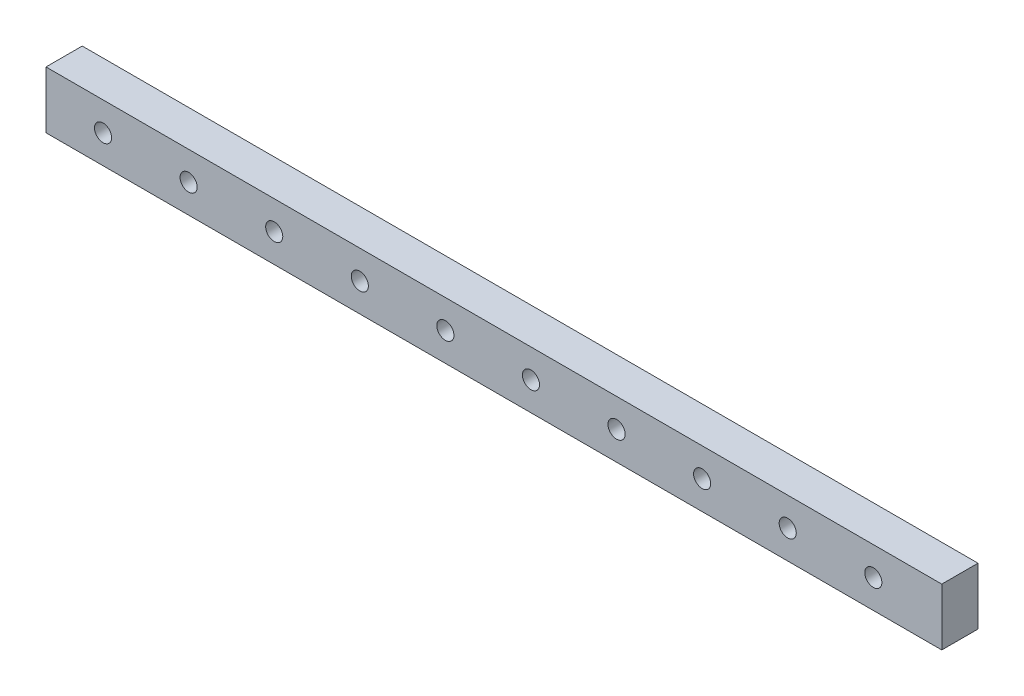
ISO-10303-21;
HEADER;
FILE_DESCRIPTION(('STEP AP214'),'2;1');
FILE_NAME('part.step','',(''),(''),'','','');
FILE_SCHEMA(('AUTOMOTIVE_DESIGN { 1 0 10303 214 1 1 1 1 }'));
ENDSEC;
DATA;
#1=APPLICATION_CONTEXT('core data for automotive mechanical design processes');
#2=APPLICATION_PROTOCOL_DEFINITION('international standard','automotive_design',2000,#1);
#3=PRODUCT_CONTEXT('',#1,'mechanical');
#4=PRODUCT('Part','Part','',(#3));
#5=PRODUCT_RELATED_PRODUCT_CATEGORY('part','',(#4));
#6=PRODUCT_DEFINITION_FORMATION('','',#4);
#7=PRODUCT_DEFINITION_CONTEXT('part definition',#1,'design');
#8=PRODUCT_DEFINITION('design','',#6,#7);
#9=PRODUCT_DEFINITION_SHAPE('','',#8);
#10=(LENGTH_UNIT() NAMED_UNIT(*) SI_UNIT(.MILLI.,.METRE.));
#11=(NAMED_UNIT(*) PLANE_ANGLE_UNIT() SI_UNIT($,.RADIAN.));
#12=(NAMED_UNIT(*) SI_UNIT($,.STERADIAN.) SOLID_ANGLE_UNIT());
#13=UNCERTAINTY_MEASURE_WITH_UNIT(LENGTH_MEASURE(1.E-05),#10,'distance_accuracy_value','');
#14=(GEOMETRIC_REPRESENTATION_CONTEXT(3) GLOBAL_UNCERTAINTY_ASSIGNED_CONTEXT((#13)) GLOBAL_UNIT_ASSIGNED_CONTEXT((#10,
#11,#12)) REPRESENTATION_CONTEXT('',''));
#15=CARTESIAN_POINT('',(0.,0.,0.));
#16=DIRECTION('',(0.,0.,1.));
#17=DIRECTION('',(1.,0.,0.));
#18=AXIS2_PLACEMENT_3D('',#15,#16,#17);
#19=CARTESIAN_POINT('',(-72.0938740395506,4.3532680602638,6.35));
#20=DIRECTION('',(1.,0.,0.));
#21=DIRECTION('',(0.,0.,-1.));
#22=AXIS2_PLACEMENT_3D('',#19,#20,#21);
#23=PLANE('',#22);
#24=DIRECTION('',(0.,-1.,0.));
#25=VECTOR('',#24,1.);
#26=CARTESIAN_POINT('',(-72.0938740395506,4.3532680602638,0.));
#27=LINE('',#26,#25);
#28=CARTESIAN_POINT('',(-72.0938740395506,4.3532680602638,0.));
#29=VERTEX_POINT('',#28);
#30=CARTESIAN_POINT('',(-72.0938740395506,-5.6467319397362,0.));
#31=VERTEX_POINT('',#30);
#32=EDGE_CURVE('E96',#29,#31,#27,.T.);
#33=ORIENTED_EDGE('',*,*,#32,.T.);
#34=DIRECTION('',(0.,0.,-1.));
#35=VECTOR('',#34,1.);
#36=CARTESIAN_POINT('',(-72.0938740395506,-5.6467319397362,6.35));
#37=LINE('',#36,#35);
#38=CARTESIAN_POINT('',(-72.0938740395506,-5.6467319397362,6.35));
#39=VERTEX_POINT('',#38);
#40=EDGE_CURVE('E11',#39,#31,#37,.T.);
#41=ORIENTED_EDGE('',*,*,#40,.F.);
#42=DIRECTION('',(0.,-1.,0.));
#43=VECTOR('',#42,1.);
#44=CARTESIAN_POINT('',(-72.0938740395506,4.3532680602638,6.35));
#45=LINE('',#44,#43);
#46=CARTESIAN_POINT('',(-72.0938740395506,4.3532680602638,6.35));
#47=VERTEX_POINT('',#46);
#48=EDGE_CURVE('E84',#47,#39,#45,.T.);
#49=ORIENTED_EDGE('',*,*,#48,.F.);
#50=DIRECTION('',(0.,0.,-1.));
#51=VECTOR('',#50,1.);
#52=CARTESIAN_POINT('',(-72.0938740395506,4.3532680602638,6.35));
#53=LINE('',#52,#51);
#54=EDGE_CURVE('E92',#47,#29,#53,.T.);
#55=ORIENTED_EDGE('',*,*,#54,.T.);
#56=EDGE_LOOP('',(#33,#41,#49,#55));
#57=FACE_BOUND('',#56,.T.);
#58=ADVANCED_FACE('F33',(#57),#23,.F.);
#59=CARTESIAN_POINT('',(-72.0938740395506,-5.6467319397362,6.35));
#60=DIRECTION('',(0.,1.,0.));
#61=DIRECTION('',(0.,0.,1.));
#62=AXIS2_PLACEMENT_3D('',#59,#60,#61);
#63=PLANE('',#62);
#64=DIRECTION('',(1.,0.,0.));
#65=VECTOR('',#64,1.);
#66=CARTESIAN_POINT('',(-72.0938740395506,-5.6467319397362,0.));
#67=LINE('',#66,#65);
#68=CARTESIAN_POINT('',(84.9061259604494,-5.6467319397362,0.));
#69=VERTEX_POINT('',#68);
#70=EDGE_CURVE('E88',#31,#69,#67,.T.);
#71=ORIENTED_EDGE('',*,*,#70,.T.);
#72=DIRECTION('',(0.,0.,-1.));
#73=VECTOR('',#72,1.);
#74=CARTESIAN_POINT('',(84.9061259604494,-5.6467319397362,6.35));
#75=LINE('',#74,#73);
#76=CARTESIAN_POINT('',(84.9061259604494,-5.6467319397362,6.35));
#77=VERTEX_POINT('',#76);
#78=EDGE_CURVE('E41',#77,#69,#75,.T.);
#79=ORIENTED_EDGE('',*,*,#78,.F.);
#80=DIRECTION('',(1.,0.,0.));
#81=VECTOR('',#80,1.);
#82=CARTESIAN_POINT('',(-72.0938740395506,-5.6467319397362,6.35));
#83=LINE('',#82,#81);
#84=EDGE_CURVE('E79',#39,#77,#83,.T.);
#85=ORIENTED_EDGE('',*,*,#84,.F.);
#86=ORIENTED_EDGE('',*,*,#40,.T.);
#87=EDGE_LOOP('',(#71,#79,#85,#86));
#88=FACE_BOUND('',#87,.T.);
#89=ADVANCED_FACE('F87',(#88),#63,.F.);
#90=CARTESIAN_POINT('',(84.9061259604494,4.3532680602638,6.35));
#91=DIRECTION('',(-1.,0.,0.));
#92=DIRECTION('',(0.,0.,1.));
#93=AXIS2_PLACEMENT_3D('',#90,#91,#92);
#94=PLANE('',#93);
#95=DIRECTION('',(0.,1.,0.));
#96=VECTOR('',#95,1.);
#97=CARTESIAN_POINT('',(84.9061259604494,4.3532680602638,0.));
#98=LINE('',#97,#96);
#99=CARTESIAN_POINT('',(84.9061259604494,4.3532680602638,0.));
#100=VERTEX_POINT('',#99);
#101=EDGE_CURVE('E66',#69,#100,#98,.T.);
#102=ORIENTED_EDGE('',*,*,#101,.T.);
#103=DIRECTION('',(0.,0.,-1.));
#104=VECTOR('',#103,1.);
#105=CARTESIAN_POINT('',(84.9061259604494,4.3532680602638,6.35));
#106=LINE('',#105,#104);
#107=CARTESIAN_POINT('',(84.9061259604494,4.3532680602638,6.35));
#108=VERTEX_POINT('',#107);
#109=EDGE_CURVE('E89',#108,#100,#106,.T.);
#110=ORIENTED_EDGE('',*,*,#109,.F.);
#111=DIRECTION('',(0.,1.,0.));
#112=VECTOR('',#111,1.);
#113=CARTESIAN_POINT('',(84.9061259604494,4.3532680602638,6.35));
#114=LINE('',#113,#112);
#115=EDGE_CURVE('E82',#77,#108,#114,.T.);
#116=ORIENTED_EDGE('',*,*,#115,.F.);
#117=ORIENTED_EDGE('',*,*,#78,.T.);
#118=EDGE_LOOP('',(#102,#110,#116,#117));
#119=FACE_BOUND('',#118,.T.);
#120=ADVANCED_FACE('F90',(#119),#94,.F.);
#121=CARTESIAN_POINT('',(-72.0938740395506,4.3532680602638,6.35));
#122=DIRECTION('',(0.,-1.,0.));
#123=DIRECTION('',(0.,0.,-1.));
#124=AXIS2_PLACEMENT_3D('',#121,#122,#123);
#125=PLANE('',#124);
#126=DIRECTION('',(-1.,0.,0.));
#127=VECTOR('',#126,1.);
#128=CARTESIAN_POINT('',(-72.0938740395506,4.3532680602638,0.));
#129=LINE('',#128,#127);
#130=EDGE_CURVE('E72',#100,#29,#129,.T.);
#131=ORIENTED_EDGE('',*,*,#130,.T.);
#132=ORIENTED_EDGE('',*,*,#54,.F.);
#133=DIRECTION('',(-1.,0.,0.));
#134=VECTOR('',#133,1.);
#135=CARTESIAN_POINT('',(-72.0938740395506,4.3532680602638,6.35));
#136=LINE('',#135,#134);
#137=EDGE_CURVE('E49',#108,#47,#136,.T.);
#138=ORIENTED_EDGE('',*,*,#137,.F.);
#139=ORIENTED_EDGE('',*,*,#109,.T.);
#140=EDGE_LOOP('',(#131,#132,#138,#139));
#141=FACE_BOUND('',#140,.T.);
#142=ADVANCED_FACE('F104',(#141),#125,.F.);
#143=CARTESIAN_POINT('',(0.,0.,6.35));
#144=DIRECTION('',(0.,0.,1.));
#145=DIRECTION('',(1.,0.,0.));
#146=AXIS2_PLACEMENT_3D('',#143,#144,#145);
#147=PLANE('',#146);
#148=CARTESIAN_POINT('',(72.9061259604494,-0.646731939736218,6.35));
#149=DIRECTION('',(0.,0.,1.));
#150=DIRECTION('',(1.,0.,0.));
#151=AXIS2_PLACEMENT_3D('',#148,#149,#150);
#152=CIRCLE('',#151,1.5);
#153=CARTESIAN_POINT('',(74.4061259604494,-0.646731939736218,6.35));
#154=VERTEX_POINT('',#153);
#155=EDGE_CURVE('E164',#154,#154,#152,.T.);
#156=ORIENTED_EDGE('',*,*,#155,.F.);
#157=EDGE_LOOP('',(#156));
#158=FACE_BOUND('',#157,.T.);
#159=CARTESIAN_POINT('',(57.9061259604494,-0.646731939736218,6.35));
#160=DIRECTION('',(0.,0.,1.));
#161=DIRECTION('',(1.,0.,0.));
#162=AXIS2_PLACEMENT_3D('',#159,#160,#161);
#163=CIRCLE('',#162,1.5);
#164=CARTESIAN_POINT('',(59.4061259604494,-0.646731939736218,6.35));
#165=VERTEX_POINT('',#164);
#166=EDGE_CURVE('E158',#165,#165,#163,.T.);
#167=ORIENTED_EDGE('',*,*,#166,.F.);
#168=EDGE_LOOP('',(#167));
#169=FACE_BOUND('',#168,.T.);
#170=CARTESIAN_POINT('',(42.9061259604494,-0.646731939736218,6.35));
#171=DIRECTION('',(0.,0.,1.));
#172=DIRECTION('',(1.,0.,0.));
#173=AXIS2_PLACEMENT_3D('',#170,#171,#172);
#174=CIRCLE('',#173,1.5);
#175=CARTESIAN_POINT('',(44.4061259604494,-0.646731939736218,6.35));
#176=VERTEX_POINT('',#175);
#177=EDGE_CURVE('E152',#176,#176,#174,.T.);
#178=ORIENTED_EDGE('',*,*,#177,.F.);
#179=EDGE_LOOP('',(#178));
#180=FACE_BOUND('',#179,.T.);
#181=CARTESIAN_POINT('',(27.9061259604494,-0.646731939736218,6.35));
#182=DIRECTION('',(0.,0.,1.));
#183=DIRECTION('',(1.,0.,0.));
#184=AXIS2_PLACEMENT_3D('',#181,#182,#183);
#185=CIRCLE('',#184,1.5);
#186=CARTESIAN_POINT('',(29.4061259604494,-0.646731939736218,6.35));
#187=VERTEX_POINT('',#186);
#188=EDGE_CURVE('E146',#187,#187,#185,.T.);
#189=ORIENTED_EDGE('',*,*,#188,.F.);
#190=EDGE_LOOP('',(#189));
#191=FACE_BOUND('',#190,.T.);
#192=CARTESIAN_POINT('',(12.9061259604494,-0.646731939736218,6.35));
#193=DIRECTION('',(0.,0.,1.));
#194=DIRECTION('',(1.,0.,0.));
#195=AXIS2_PLACEMENT_3D('',#192,#193,#194);
#196=CIRCLE('',#195,1.5);
#197=CARTESIAN_POINT('',(14.4061259604494,-0.646731939736218,6.35));
#198=VERTEX_POINT('',#197);
#199=EDGE_CURVE('E140',#198,#198,#196,.T.);
#200=ORIENTED_EDGE('',*,*,#199,.F.);
#201=EDGE_LOOP('',(#200));
#202=FACE_BOUND('',#201,.T.);
#203=CARTESIAN_POINT('',(-2.09387403955062,-0.646731939736218,6.35));
#204=DIRECTION('',(0.,0.,1.));
#205=DIRECTION('',(1.,0.,0.));
#206=AXIS2_PLACEMENT_3D('',#203,#204,#205);
#207=CIRCLE('',#206,1.5);
#208=CARTESIAN_POINT('',(-0.593874039550616,-0.646731939736218,6.35));
#209=VERTEX_POINT('',#208);
#210=EDGE_CURVE('E134',#209,#209,#207,.T.);
#211=ORIENTED_EDGE('',*,*,#210,.F.);
#212=EDGE_LOOP('',(#211));
#213=FACE_BOUND('',#212,.T.);
#214=CARTESIAN_POINT('',(-17.0938740395506,-0.646731939736218,6.35));
#215=DIRECTION('',(0.,0.,1.));
#216=DIRECTION('',(1.,0.,0.));
#217=AXIS2_PLACEMENT_3D('',#214,#215,#216);
#218=CIRCLE('',#217,1.5);
#219=CARTESIAN_POINT('',(-15.5938740395506,-0.646731939736218,6.35));
#220=VERTEX_POINT('',#219);
#221=EDGE_CURVE('E128',#220,#220,#218,.T.);
#222=ORIENTED_EDGE('',*,*,#221,.F.);
#223=EDGE_LOOP('',(#222));
#224=FACE_BOUND('',#223,.T.);
#225=CARTESIAN_POINT('',(-32.0938740395506,-0.646731939736218,6.35));
#226=DIRECTION('',(0.,0.,1.));
#227=DIRECTION('',(1.,0.,0.));
#228=AXIS2_PLACEMENT_3D('',#225,#226,#227);
#229=CIRCLE('',#228,1.5);
#230=CARTESIAN_POINT('',(-30.5938740395506,-0.646731939736218,6.35));
#231=VERTEX_POINT('',#230);
#232=EDGE_CURVE('E122',#231,#231,#229,.T.);
#233=ORIENTED_EDGE('',*,*,#232,.F.);
#234=EDGE_LOOP('',(#233));
#235=FACE_BOUND('',#234,.T.);
#236=CARTESIAN_POINT('',(-47.0938740395506,-0.646731939736218,6.35));
#237=DIRECTION('',(0.,0.,1.));
#238=DIRECTION('',(1.,0.,0.));
#239=AXIS2_PLACEMENT_3D('',#236,#237,#238);
#240=CIRCLE('',#239,1.5);
#241=CARTESIAN_POINT('',(-45.5938740395506,-0.646731939736218,6.35));
#242=VERTEX_POINT('',#241);
#243=EDGE_CURVE('E116',#242,#242,#240,.T.);
#244=ORIENTED_EDGE('',*,*,#243,.F.);
#245=EDGE_LOOP('',(#244));
#246=FACE_BOUND('',#245,.T.);
#247=CARTESIAN_POINT('',(-62.0938740395506,-0.646731939736218,6.35));
#248=DIRECTION('',(0.,0.,1.));
#249=DIRECTION('',(1.,0.,0.));
#250=AXIS2_PLACEMENT_3D('',#247,#248,#249);
#251=CIRCLE('',#250,1.5);
#252=CARTESIAN_POINT('',(-60.5938740395506,-0.646731939736218,6.35));
#253=VERTEX_POINT('',#252);
#254=EDGE_CURVE('E110',#253,#253,#251,.T.);
#255=ORIENTED_EDGE('',*,*,#254,.F.);
#256=EDGE_LOOP('',(#255));
#257=FACE_BOUND('',#256,.T.);
#258=ORIENTED_EDGE('',*,*,#48,.T.);
#259=ORIENTED_EDGE('',*,*,#84,.T.);
#260=ORIENTED_EDGE('',*,*,#115,.T.);
#261=ORIENTED_EDGE('',*,*,#137,.T.);
#262=EDGE_LOOP('',(#258,#259,#260,#261));
#263=FACE_BOUND('',#262,.T.);
#264=ADVANCED_FACE('F80',(#158,#169,#180,#191,#202,#213,#224,#235,#246,#257,#263),#147,.T.);
#265=CARTESIAN_POINT('',(0.,0.,0.));
#266=DIRECTION('',(0.,0.,1.));
#267=DIRECTION('',(1.,0.,0.));
#268=AXIS2_PLACEMENT_3D('',#265,#266,#267);
#269=PLANE('',#268);
#270=CARTESIAN_POINT('',(72.9061259604494,-0.646731939736218,0.));
#271=DIRECTION('',(0.,0.,1.));
#272=DIRECTION('',(1.,0.,0.));
#273=AXIS2_PLACEMENT_3D('',#270,#271,#272);
#274=CIRCLE('',#273,1.5);
#275=CARTESIAN_POINT('',(74.4061259604494,-0.646731939736218,0.));
#276=VERTEX_POINT('',#275);
#277=EDGE_CURVE('E161',#276,#276,#274,.T.);
#278=ORIENTED_EDGE('',*,*,#277,.T.);
#279=EDGE_LOOP('',(#278));
#280=FACE_BOUND('',#279,.T.);
#281=CARTESIAN_POINT('',(57.9061259604494,-0.646731939736218,0.));
#282=DIRECTION('',(0.,0.,1.));
#283=DIRECTION('',(1.,0.,0.));
#284=AXIS2_PLACEMENT_3D('',#281,#282,#283);
#285=CIRCLE('',#284,1.5);
#286=CARTESIAN_POINT('',(59.4061259604494,-0.646731939736218,0.));
#287=VERTEX_POINT('',#286);
#288=EDGE_CURVE('E155',#287,#287,#285,.T.);
#289=ORIENTED_EDGE('',*,*,#288,.T.);
#290=EDGE_LOOP('',(#289));
#291=FACE_BOUND('',#290,.T.);
#292=CARTESIAN_POINT('',(42.9061259604494,-0.646731939736218,0.));
#293=DIRECTION('',(0.,0.,1.));
#294=DIRECTION('',(1.,0.,0.));
#295=AXIS2_PLACEMENT_3D('',#292,#293,#294);
#296=CIRCLE('',#295,1.5);
#297=CARTESIAN_POINT('',(44.4061259604494,-0.646731939736218,0.));
#298=VERTEX_POINT('',#297);
#299=EDGE_CURVE('E149',#298,#298,#296,.T.);
#300=ORIENTED_EDGE('',*,*,#299,.T.);
#301=EDGE_LOOP('',(#300));
#302=FACE_BOUND('',#301,.T.);
#303=CARTESIAN_POINT('',(27.9061259604494,-0.646731939736218,0.));
#304=DIRECTION('',(0.,0.,1.));
#305=DIRECTION('',(1.,0.,0.));
#306=AXIS2_PLACEMENT_3D('',#303,#304,#305);
#307=CIRCLE('',#306,1.5);
#308=CARTESIAN_POINT('',(29.4061259604494,-0.646731939736218,0.));
#309=VERTEX_POINT('',#308);
#310=EDGE_CURVE('E143',#309,#309,#307,.T.);
#311=ORIENTED_EDGE('',*,*,#310,.T.);
#312=EDGE_LOOP('',(#311));
#313=FACE_BOUND('',#312,.T.);
#314=CARTESIAN_POINT('',(12.9061259604494,-0.646731939736218,0.));
#315=DIRECTION('',(0.,0.,1.));
#316=DIRECTION('',(1.,0.,0.));
#317=AXIS2_PLACEMENT_3D('',#314,#315,#316);
#318=CIRCLE('',#317,1.5);
#319=CARTESIAN_POINT('',(14.4061259604494,-0.646731939736218,0.));
#320=VERTEX_POINT('',#319);
#321=EDGE_CURVE('E137',#320,#320,#318,.T.);
#322=ORIENTED_EDGE('',*,*,#321,.T.);
#323=EDGE_LOOP('',(#322));
#324=FACE_BOUND('',#323,.T.);
#325=CARTESIAN_POINT('',(-2.09387403955062,-0.646731939736218,0.));
#326=DIRECTION('',(0.,0.,1.));
#327=DIRECTION('',(1.,0.,0.));
#328=AXIS2_PLACEMENT_3D('',#325,#326,#327);
#329=CIRCLE('',#328,1.5);
#330=CARTESIAN_POINT('',(-0.593874039550616,-0.646731939736218,0.));
#331=VERTEX_POINT('',#330);
#332=EDGE_CURVE('E131',#331,#331,#329,.T.);
#333=ORIENTED_EDGE('',*,*,#332,.T.);
#334=EDGE_LOOP('',(#333));
#335=FACE_BOUND('',#334,.T.);
#336=CARTESIAN_POINT('',(-17.0938740395506,-0.646731939736218,0.));
#337=DIRECTION('',(0.,0.,1.));
#338=DIRECTION('',(1.,0.,0.));
#339=AXIS2_PLACEMENT_3D('',#336,#337,#338);
#340=CIRCLE('',#339,1.5);
#341=CARTESIAN_POINT('',(-15.5938740395506,-0.646731939736218,0.));
#342=VERTEX_POINT('',#341);
#343=EDGE_CURVE('E125',#342,#342,#340,.T.);
#344=ORIENTED_EDGE('',*,*,#343,.T.);
#345=EDGE_LOOP('',(#344));
#346=FACE_BOUND('',#345,.T.);
#347=CARTESIAN_POINT('',(-32.0938740395506,-0.646731939736218,0.));
#348=DIRECTION('',(0.,0.,1.));
#349=DIRECTION('',(1.,0.,0.));
#350=AXIS2_PLACEMENT_3D('',#347,#348,#349);
#351=CIRCLE('',#350,1.5);
#352=CARTESIAN_POINT('',(-30.5938740395506,-0.646731939736218,0.));
#353=VERTEX_POINT('',#352);
#354=EDGE_CURVE('E119',#353,#353,#351,.T.);
#355=ORIENTED_EDGE('',*,*,#354,.T.);
#356=EDGE_LOOP('',(#355));
#357=FACE_BOUND('',#356,.T.);
#358=CARTESIAN_POINT('',(-47.0938740395506,-0.646731939736218,0.));
#359=DIRECTION('',(0.,0.,1.));
#360=DIRECTION('',(1.,0.,0.));
#361=AXIS2_PLACEMENT_3D('',#358,#359,#360);
#362=CIRCLE('',#361,1.5);
#363=CARTESIAN_POINT('',(-45.5938740395506,-0.646731939736218,0.));
#364=VERTEX_POINT('',#363);
#365=EDGE_CURVE('E113',#364,#364,#362,.T.);
#366=ORIENTED_EDGE('',*,*,#365,.T.);
#367=EDGE_LOOP('',(#366));
#368=FACE_BOUND('',#367,.T.);
#369=CARTESIAN_POINT('',(-62.0938740395506,-0.646731939736218,0.));
#370=DIRECTION('',(0.,0.,1.));
#371=DIRECTION('',(1.,0.,0.));
#372=AXIS2_PLACEMENT_3D('',#369,#370,#371);
#373=CIRCLE('',#372,1.5);
#374=CARTESIAN_POINT('',(-60.5938740395506,-0.646731939736218,0.));
#375=VERTEX_POINT('',#374);
#376=EDGE_CURVE('E99',#375,#375,#373,.T.);
#377=ORIENTED_EDGE('',*,*,#376,.T.);
#378=EDGE_LOOP('',(#377));
#379=FACE_BOUND('',#378,.T.);
#380=ORIENTED_EDGE('',*,*,#32,.F.);
#381=ORIENTED_EDGE('',*,*,#130,.F.);
#382=ORIENTED_EDGE('',*,*,#101,.F.);
#383=ORIENTED_EDGE('',*,*,#70,.F.);
#384=EDGE_LOOP('',(#380,#381,#382,#383));
#385=FACE_BOUND('',#384,.T.);
#386=ADVANCED_FACE('F107',(#280,#291,#302,#313,#324,#335,#346,#357,#368,#379,#385),#269,.F.);
#387=CARTESIAN_POINT('',(-62.0938740395506,-0.646731939736218,0.));
#388=DIRECTION('',(0.,0.,1.));
#389=DIRECTION('',(1.,0.,0.));
#390=AXIS2_PLACEMENT_3D('',#387,#388,#389);
#391=CYLINDRICAL_SURFACE('',#390,1.5);
#392=ORIENTED_EDGE('',*,*,#376,.F.);
#393=EDGE_LOOP('',(#392));
#394=FACE_BOUND('',#393,.T.);
#395=ORIENTED_EDGE('',*,*,#254,.T.);
#396=EDGE_LOOP('',(#395));
#397=FACE_BOUND('',#396,.T.);
#398=ADVANCED_FACE('F200',(#394,#397),#391,.F.);
#399=CARTESIAN_POINT('',(-47.0938740395506,-0.646731939736218,0.));
#400=DIRECTION('',(0.,0.,1.));
#401=DIRECTION('',(1.,0.,0.));
#402=AXIS2_PLACEMENT_3D('',#399,#400,#401);
#403=CYLINDRICAL_SURFACE('',#402,1.5);
#404=ORIENTED_EDGE('',*,*,#365,.F.);
#405=EDGE_LOOP('',(#404));
#406=FACE_BOUND('',#405,.T.);
#407=ORIENTED_EDGE('',*,*,#243,.T.);
#408=EDGE_LOOP('',(#407));
#409=FACE_BOUND('',#408,.T.);
#410=ADVANCED_FACE('F202',(#406,#409),#403,.F.);
#411=CARTESIAN_POINT('',(-32.0938740395506,-0.646731939736218,0.));
#412=DIRECTION('',(0.,0.,1.));
#413=DIRECTION('',(1.,0.,0.));
#414=AXIS2_PLACEMENT_3D('',#411,#412,#413);
#415=CYLINDRICAL_SURFACE('',#414,1.5);
#416=ORIENTED_EDGE('',*,*,#354,.F.);
#417=EDGE_LOOP('',(#416));
#418=FACE_BOUND('',#417,.T.);
#419=ORIENTED_EDGE('',*,*,#232,.T.);
#420=EDGE_LOOP('',(#419));
#421=FACE_BOUND('',#420,.T.);
#422=ADVANCED_FACE('F209',(#418,#421),#415,.F.);
#423=CARTESIAN_POINT('',(-17.0938740395506,-0.646731939736218,0.));
#424=DIRECTION('',(0.,0.,1.));
#425=DIRECTION('',(1.,0.,0.));
#426=AXIS2_PLACEMENT_3D('',#423,#424,#425);
#427=CYLINDRICAL_SURFACE('',#426,1.5);
#428=ORIENTED_EDGE('',*,*,#343,.F.);
#429=EDGE_LOOP('',(#428));
#430=FACE_BOUND('',#429,.T.);
#431=ORIENTED_EDGE('',*,*,#221,.T.);
#432=EDGE_LOOP('',(#431));
#433=FACE_BOUND('',#432,.T.);
#434=ADVANCED_FACE('F255',(#430,#433),#427,.F.);
#435=CARTESIAN_POINT('',(-2.09387403955062,-0.646731939736218,0.));
#436=DIRECTION('',(0.,0.,1.));
#437=DIRECTION('',(1.,0.,0.));
#438=AXIS2_PLACEMENT_3D('',#435,#436,#437);
#439=CYLINDRICAL_SURFACE('',#438,1.5);
#440=ORIENTED_EDGE('',*,*,#332,.F.);
#441=EDGE_LOOP('',(#440));
#442=FACE_BOUND('',#441,.T.);
#443=ORIENTED_EDGE('',*,*,#210,.T.);
#444=EDGE_LOOP('',(#443));
#445=FACE_BOUND('',#444,.T.);
#446=ADVANCED_FACE('F265',(#442,#445),#439,.F.);
#447=CARTESIAN_POINT('',(12.9061259604494,-0.646731939736218,0.));
#448=DIRECTION('',(0.,0.,1.));
#449=DIRECTION('',(1.,0.,0.));
#450=AXIS2_PLACEMENT_3D('',#447,#448,#449);
#451=CYLINDRICAL_SURFACE('',#450,1.5);
#452=ORIENTED_EDGE('',*,*,#321,.F.);
#453=EDGE_LOOP('',(#452));
#454=FACE_BOUND('',#453,.T.);
#455=ORIENTED_EDGE('',*,*,#199,.T.);
#456=EDGE_LOOP('',(#455));
#457=FACE_BOUND('',#456,.T.);
#458=ADVANCED_FACE('F275',(#454,#457),#451,.F.);
#459=CARTESIAN_POINT('',(27.9061259604494,-0.646731939736218,0.));
#460=DIRECTION('',(0.,0.,1.));
#461=DIRECTION('',(1.,0.,0.));
#462=AXIS2_PLACEMENT_3D('',#459,#460,#461);
#463=CYLINDRICAL_SURFACE('',#462,1.5);
#464=ORIENTED_EDGE('',*,*,#310,.F.);
#465=EDGE_LOOP('',(#464));
#466=FACE_BOUND('',#465,.T.);
#467=ORIENTED_EDGE('',*,*,#188,.T.);
#468=EDGE_LOOP('',(#467));
#469=FACE_BOUND('',#468,.T.);
#470=ADVANCED_FACE('F285',(#466,#469),#463,.F.);
#471=CARTESIAN_POINT('',(42.9061259604494,-0.646731939736218,0.));
#472=DIRECTION('',(0.,0.,1.));
#473=DIRECTION('',(1.,0.,0.));
#474=AXIS2_PLACEMENT_3D('',#471,#472,#473);
#475=CYLINDRICAL_SURFACE('',#474,1.5);
#476=ORIENTED_EDGE('',*,*,#299,.F.);
#477=EDGE_LOOP('',(#476));
#478=FACE_BOUND('',#477,.T.);
#479=ORIENTED_EDGE('',*,*,#177,.T.);
#480=EDGE_LOOP('',(#479));
#481=FACE_BOUND('',#480,.T.);
#482=ADVANCED_FACE('F295',(#478,#481),#475,.F.);
#483=CARTESIAN_POINT('',(57.9061259604494,-0.646731939736218,0.));
#484=DIRECTION('',(0.,0.,1.));
#485=DIRECTION('',(1.,0.,0.));
#486=AXIS2_PLACEMENT_3D('',#483,#484,#485);
#487=CYLINDRICAL_SURFACE('',#486,1.5);
#488=ORIENTED_EDGE('',*,*,#288,.F.);
#489=EDGE_LOOP('',(#488));
#490=FACE_BOUND('',#489,.T.);
#491=ORIENTED_EDGE('',*,*,#166,.T.);
#492=EDGE_LOOP('',(#491));
#493=FACE_BOUND('',#492,.T.);
#494=ADVANCED_FACE('F175',(#490,#493),#487,.F.);
#495=CARTESIAN_POINT('',(72.9061259604494,-0.646731939736218,0.));
#496=DIRECTION('',(0.,0.,1.));
#497=DIRECTION('',(1.,0.,0.));
#498=AXIS2_PLACEMENT_3D('',#495,#496,#497);
#499=CYLINDRICAL_SURFACE('',#498,1.5);
#500=ORIENTED_EDGE('',*,*,#277,.F.);
#501=EDGE_LOOP('',(#500));
#502=FACE_BOUND('',#501,.T.);
#503=ORIENTED_EDGE('',*,*,#155,.T.);
#504=EDGE_LOOP('',(#503));
#505=FACE_BOUND('',#504,.T.);
#506=ADVANCED_FACE('F172',(#502,#505),#499,.F.);
#507=CLOSED_SHELL('',(#58,#89,#120,#142,#264,#386,#398,#410,#422,#434,#446,#458,#470,#482,#494,#506));
#508=MANIFOLD_SOLID_BREP('B2',#507);
#509=ADVANCED_BREP_SHAPE_REPRESENTATION('',(#18,#508),#14);
#510=SHAPE_DEFINITION_REPRESENTATION(#9,#509);
ENDSEC;
END-ISO-10303-21;
